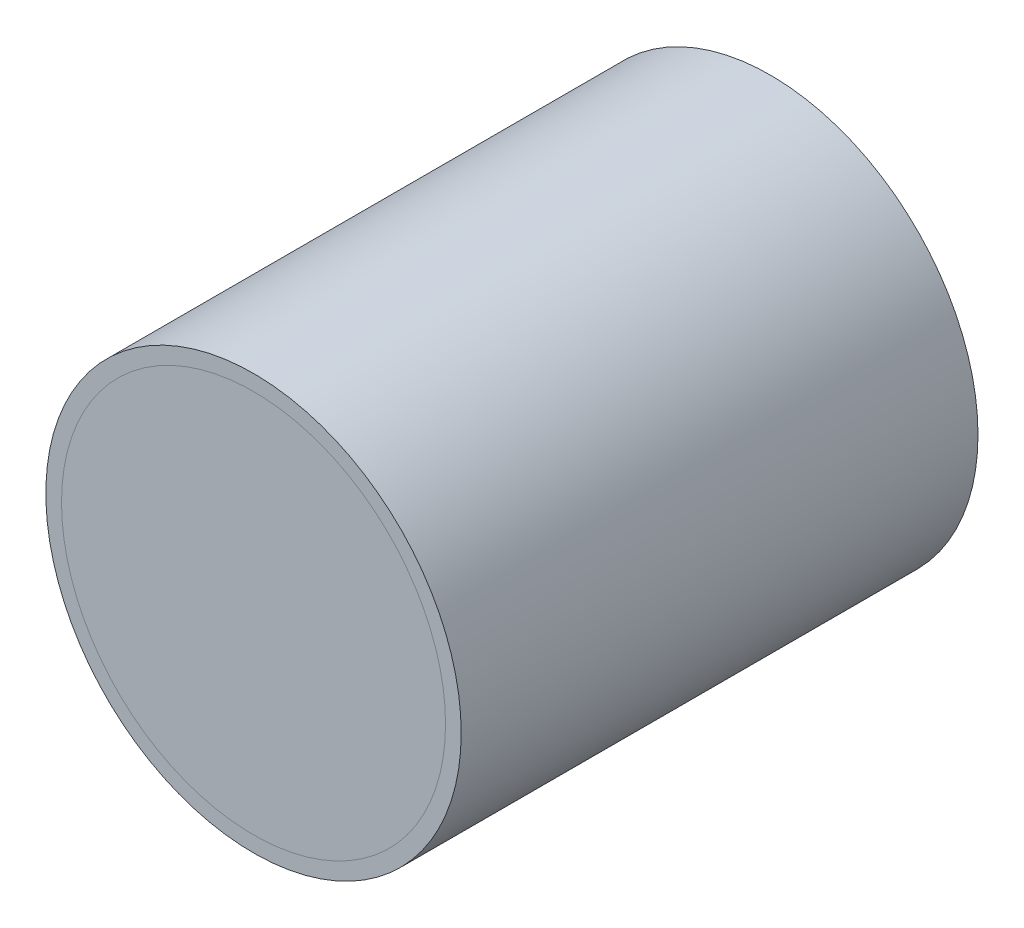
ISO-10303-21;
HEADER;
FILE_DESCRIPTION(('STEP AP214'),'2;1');
FILE_NAME('part.step','',(''),(''),'','','');
FILE_SCHEMA(('AUTOMOTIVE_DESIGN { 1 0 10303 214 1 1 1 1 }'));
ENDSEC;
DATA;
#1=APPLICATION_CONTEXT('core data for automotive mechanical design processes');
#2=APPLICATION_PROTOCOL_DEFINITION('international standard','automotive_design',2000,#1);
#3=PRODUCT_CONTEXT('',#1,'mechanical');
#4=PRODUCT('Part','Part','',(#3));
#5=PRODUCT_RELATED_PRODUCT_CATEGORY('part','',(#4));
#6=PRODUCT_DEFINITION_FORMATION('','',#4);
#7=PRODUCT_DEFINITION_CONTEXT('part definition',#1,'design');
#8=PRODUCT_DEFINITION('design','',#6,#7);
#9=PRODUCT_DEFINITION_SHAPE('','',#8);
#10=(LENGTH_UNIT() NAMED_UNIT(*) SI_UNIT(.MILLI.,.METRE.));
#11=(NAMED_UNIT(*) PLANE_ANGLE_UNIT() SI_UNIT($,.RADIAN.));
#12=(NAMED_UNIT(*) SI_UNIT($,.STERADIAN.) SOLID_ANGLE_UNIT());
#13=UNCERTAINTY_MEASURE_WITH_UNIT(LENGTH_MEASURE(1.E-05),#10,'distance_accuracy_value','');
#14=(GEOMETRIC_REPRESENTATION_CONTEXT(3) GLOBAL_UNCERTAINTY_ASSIGNED_CONTEXT((#13)) GLOBAL_UNIT_ASSIGNED_CONTEXT((#10,
#11,#12)) REPRESENTATION_CONTEXT('',''));
#15=CARTESIAN_POINT('',(0.,0.,0.));
#16=DIRECTION('',(0.,0.,1.));
#17=DIRECTION('',(1.,0.,0.));
#18=AXIS2_PLACEMENT_3D('',#15,#16,#17);
#19=CARTESIAN_POINT('',(0.,0.,39.538057809132));
#20=DIRECTION('',(0.,0.,-1.));
#21=DIRECTION('',(-1.,0.,0.));
#22=AXIS2_PLACEMENT_3D('',#19,#20,#21);
#23=CYLINDRICAL_SURFACE('',#22,7.1628);
#24=CARTESIAN_POINT('',(0.,0.,0.));
#25=DIRECTION('',(0.,0.,1.));
#26=DIRECTION('',(1.,0.,0.));
#27=AXIS2_PLACEMENT_3D('',#24,#25,#26);
#28=CIRCLE('',#27,7.1628);
#29=CARTESIAN_POINT('',(7.1628,0.,0.));
#30=VERTEX_POINT('',#29);
#31=EDGE_CURVE('E60',#30,#30,#28,.T.);
#32=ORIENTED_EDGE('',*,*,#31,.T.);
#33=EDGE_LOOP('',(#32));
#34=FACE_BOUND('',#33,.T.);
#35=CARTESIAN_POINT('',(0.,0.,19.2786));
#36=DIRECTION('',(0.,0.,1.));
#37=DIRECTION('',(1.,0.,0.));
#38=AXIS2_PLACEMENT_3D('',#35,#36,#37);
#39=CIRCLE('',#38,7.1628);
#40=CARTESIAN_POINT('',(7.1628,0.,19.2786));
#41=VERTEX_POINT('',#40);
#42=EDGE_CURVE('E11',#41,#41,#39,.T.);
#43=ORIENTED_EDGE('',*,*,#42,.F.);
#44=EDGE_LOOP('',(#43));
#45=FACE_BOUND('',#44,.T.);
#46=ADVANCED_FACE('F53',(#34,#45),#23,.T.);
#47=CARTESIAN_POINT('',(0.,0.,0.));
#48=DIRECTION('',(0.,0.,1.));
#49=DIRECTION('',(1.,0.,0.));
#50=AXIS2_PLACEMENT_3D('',#47,#48,#49);
#51=PLANE('',#50);
#52=ORIENTED_EDGE('',*,*,#31,.F.);
#53=EDGE_LOOP('',(#52));
#54=FACE_BOUND('',#53,.T.);
#55=ADVANCED_FACE('F68',(#54),#51,.F.);
#56=CARTESIAN_POINT('',(0.,0.,19.2786));
#57=DIRECTION('',(0.,0.,1.));
#58=DIRECTION('',(1.,0.,0.));
#59=AXIS2_PLACEMENT_3D('',#56,#57,#58);
#60=PLANE('',#59);
#61=ORIENTED_EDGE('',*,*,#42,.T.);
#62=EDGE_LOOP('',(#61));
#63=FACE_BOUND('',#62,.T.);
#64=ADVANCED_FACE('F55',(#63),#60,.T.);
#65=CLOSED_SHELL('',(#46,#55,#64));
#66=MANIFOLD_SOLID_BREP('B2',#65);
#67=CARTESIAN_POINT('',(0.,0.,19.2786));
#68=DIRECTION('',(0.,0.,1.));
#69=DIRECTION('',(1.,0.,0.));
#70=AXIS2_PLACEMENT_3D('',#67,#68,#69);
#71=PLANE('',#70);
#72=CARTESIAN_POINT('',(0.,0.,19.2786));
#73=DIRECTION('',(0.,0.,1.));
#74=DIRECTION('',(1.,0.,0.));
#75=AXIS2_PLACEMENT_3D('',#72,#73,#74);
#76=CIRCLE('',#75,7.747);
#77=CARTESIAN_POINT('',(7.747,0.,19.2786));
#78=VERTEX_POINT('',#77);
#79=EDGE_CURVE('E52',#78,#78,#76,.T.);
#80=ORIENTED_EDGE('',*,*,#79,.T.);
#81=EDGE_LOOP('',(#80));
#82=FACE_BOUND('',#81,.T.);
#83=CARTESIAN_POINT('',(0.,0.,19.2786));
#84=DIRECTION('',(0.,0.,1.));
#85=DIRECTION('',(1.,0.,0.));
#86=AXIS2_PLACEMENT_3D('',#83,#84,#85);
#87=CIRCLE('',#86,7.1628);
#88=CARTESIAN_POINT('',(7.1628,0.,19.2786));
#89=VERTEX_POINT('',#88);
#90=EDGE_CURVE('E117',#89,#89,#87,.T.);
#91=ORIENTED_EDGE('',*,*,#90,.F.);
#92=EDGE_LOOP('',(#91));
#93=FACE_BOUND('',#92,.T.);
#94=ADVANCED_FACE('F106',(#82,#93),#71,.T.);
#95=CARTESIAN_POINT('',(0.,0.,0.));
#96=DIRECTION('',(0.,0.,1.));
#97=DIRECTION('',(1.,0.,0.));
#98=AXIS2_PLACEMENT_3D('',#95,#96,#97);
#99=PLANE('',#98);
#100=CARTESIAN_POINT('',(0.,0.,0.));
#101=DIRECTION('',(0.,0.,1.));
#102=DIRECTION('',(1.,0.,0.));
#103=AXIS2_PLACEMENT_3D('',#100,#101,#102);
#104=CIRCLE('',#103,7.747);
#105=CARTESIAN_POINT('',(7.747,0.,0.));
#106=VERTEX_POINT('',#105);
#107=EDGE_CURVE('E110',#106,#106,#104,.T.);
#108=ORIENTED_EDGE('',*,*,#107,.F.);
#109=EDGE_LOOP('',(#108));
#110=FACE_BOUND('',#109,.T.);
#111=CARTESIAN_POINT('',(0.,0.,0.));
#112=DIRECTION('',(0.,0.,1.));
#113=DIRECTION('',(1.,0.,0.));
#114=AXIS2_PLACEMENT_3D('',#111,#112,#113);
#115=CIRCLE('',#114,7.1628);
#116=CARTESIAN_POINT('',(7.1628,0.,0.));
#117=VERTEX_POINT('',#116);
#118=EDGE_CURVE('E119',#117,#117,#115,.T.);
#119=ORIENTED_EDGE('',*,*,#118,.T.);
#120=EDGE_LOOP('',(#119));
#121=FACE_BOUND('',#120,.T.);
#122=ADVANCED_FACE('F129',(#110,#121),#99,.F.);
#123=CARTESIAN_POINT('',(0.,0.,19.2786));
#124=DIRECTION('',(0.,0.,-1.));
#125=DIRECTION('',(-1.,0.,0.));
#126=AXIS2_PLACEMENT_3D('',#123,#124,#125);
#127=CYLINDRICAL_SURFACE('',#126,7.747);
#128=ORIENTED_EDGE('',*,*,#79,.F.);
#129=EDGE_LOOP('',(#128));
#130=FACE_BOUND('',#129,.T.);
#131=ORIENTED_EDGE('',*,*,#107,.T.);
#132=EDGE_LOOP('',(#131));
#133=FACE_BOUND('',#132,.T.);
#134=ADVANCED_FACE('F108',(#130,#133),#127,.T.);
#135=CARTESIAN_POINT('',(0.,0.,19.2786));
#136=DIRECTION('',(0.,0.,-1.));
#137=DIRECTION('',(-1.,0.,0.));
#138=AXIS2_PLACEMENT_3D('',#135,#136,#137);
#139=CYLINDRICAL_SURFACE('',#138,7.1628);
#140=ORIENTED_EDGE('',*,*,#90,.T.);
#141=EDGE_LOOP('',(#140));
#142=FACE_BOUND('',#141,.T.);
#143=ORIENTED_EDGE('',*,*,#118,.F.);
#144=EDGE_LOOP('',(#143));
#145=FACE_BOUND('',#144,.T.);
#146=ADVANCED_FACE('F125',(#142,#145),#139,.F.);
#147=CLOSED_SHELL('',(#94,#122,#134,#146));
#148=MANIFOLD_SOLID_BREP('B6',#147);
#149=ADVANCED_BREP_SHAPE_REPRESENTATION('',(#18,#66,#148),#14);
#150=SHAPE_DEFINITION_REPRESENTATION(#9,#149);
ENDSEC;
END-ISO-10303-21;
